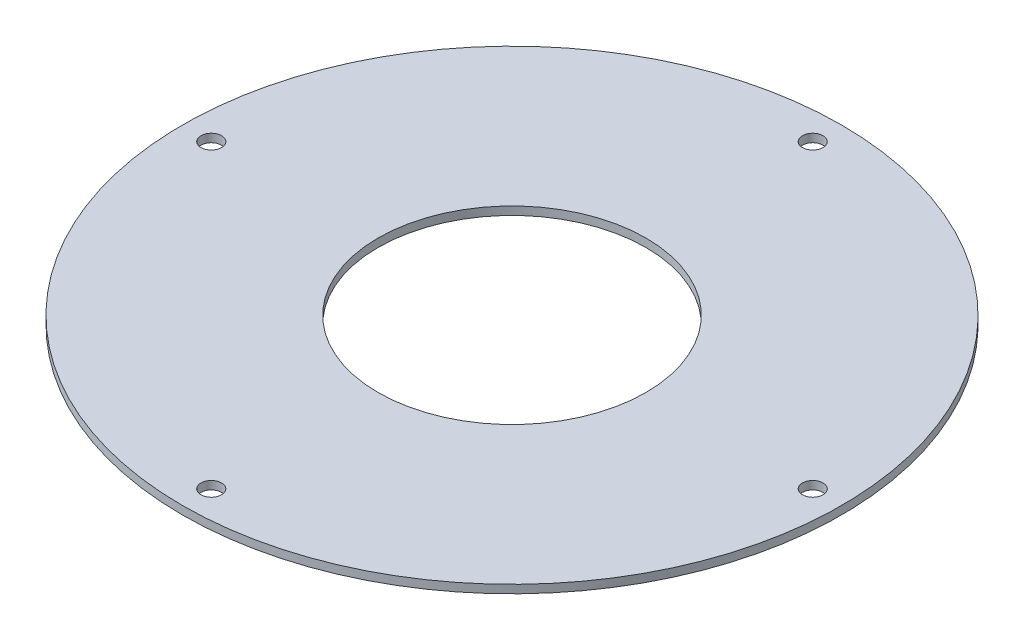
ISO-10303-21;
HEADER;
FILE_DESCRIPTION(('STEP AP214'),'2;1');
FILE_NAME('part.step','',(''),(''),'','','');
FILE_SCHEMA(('AUTOMOTIVE_DESIGN { 1 0 10303 214 1 1 1 1 }'));
ENDSEC;
DATA;
#1=APPLICATION_CONTEXT('core data for automotive mechanical design processes');
#2=APPLICATION_PROTOCOL_DEFINITION('international standard','automotive_design',2000,#1);
#3=PRODUCT_CONTEXT('',#1,'mechanical');
#4=PRODUCT('Part','Part','',(#3));
#5=PRODUCT_RELATED_PRODUCT_CATEGORY('part','',(#4));
#6=PRODUCT_DEFINITION_FORMATION('','',#4);
#7=PRODUCT_DEFINITION_CONTEXT('part definition',#1,'design');
#8=PRODUCT_DEFINITION('design','',#6,#7);
#9=PRODUCT_DEFINITION_SHAPE('','',#8);
#10=(LENGTH_UNIT() NAMED_UNIT(*) SI_UNIT(.MILLI.,.METRE.));
#11=(NAMED_UNIT(*) PLANE_ANGLE_UNIT() SI_UNIT($,.RADIAN.));
#12=(NAMED_UNIT(*) SI_UNIT($,.STERADIAN.) SOLID_ANGLE_UNIT());
#13=UNCERTAINTY_MEASURE_WITH_UNIT(LENGTH_MEASURE(1.E-05),#10,'distance_accuracy_value','');
#14=(GEOMETRIC_REPRESENTATION_CONTEXT(3) GLOBAL_UNCERTAINTY_ASSIGNED_CONTEXT((#13)) GLOBAL_UNIT_ASSIGNED_CONTEXT((#10,
#11,#12)) REPRESENTATION_CONTEXT('',''));
#15=CARTESIAN_POINT('',(0.,0.,0.));
#16=DIRECTION('',(0.,0.,1.));
#17=DIRECTION('',(1.,0.,0.));
#18=AXIS2_PLACEMENT_3D('',#15,#16,#17);
#19=CARTESIAN_POINT('',(0.,2.,0.));
#20=DIRECTION('',(0.,1.,0.));
#21=DIRECTION('',(0.,0.,1.));
#22=AXIS2_PLACEMENT_3D('',#19,#20,#21);
#23=PLANE('',#22);
#24=CARTESIAN_POINT('',(0.,2.,-73.));
#25=DIRECTION('',(0.,1.,0.));
#26=DIRECTION('',(0.,0.,1.));
#27=AXIS2_PLACEMENT_3D('',#24,#25,#26);
#28=CIRCLE('',#27,2.5);
#29=CARTESIAN_POINT('',(0.,2.,-70.5));
#30=VERTEX_POINT('',#29);
#31=EDGE_CURVE('E88',#30,#30,#28,.T.);
#32=ORIENTED_EDGE('',*,*,#31,.F.);
#33=EDGE_LOOP('',(#32));
#34=FACE_BOUND('',#33,.T.);
#35=CARTESIAN_POINT('',(73.,2.,0.));
#36=DIRECTION('',(0.,1.,0.));
#37=DIRECTION('',(0.,0.,1.));
#38=AXIS2_PLACEMENT_3D('',#35,#36,#37);
#39=CIRCLE('',#38,2.50000000000001);
#40=CARTESIAN_POINT('',(73.,2.,2.5));
#41=VERTEX_POINT('',#40);
#42=EDGE_CURVE('E84',#41,#41,#39,.T.);
#43=ORIENTED_EDGE('',*,*,#42,.F.);
#44=EDGE_LOOP('',(#43));
#45=FACE_BOUND('',#44,.T.);
#46=CARTESIAN_POINT('',(0.,2.,73.));
#47=DIRECTION('',(0.,1.,0.));
#48=DIRECTION('',(0.,0.,1.));
#49=AXIS2_PLACEMENT_3D('',#46,#47,#48);
#50=CIRCLE('',#49,2.5);
#51=CARTESIAN_POINT('',(0.,2.,75.5));
#52=VERTEX_POINT('',#51);
#53=EDGE_CURVE('E76',#52,#52,#50,.T.);
#54=ORIENTED_EDGE('',*,*,#53,.F.);
#55=EDGE_LOOP('',(#54));
#56=FACE_BOUND('',#55,.T.);
#57=CARTESIAN_POINT('',(-73.,2.,0.));
#58=DIRECTION('',(0.,1.,0.));
#59=DIRECTION('',(0.,0.,1.));
#60=AXIS2_PLACEMENT_3D('',#57,#58,#59);
#61=CIRCLE('',#60,2.50000000000001);
#62=CARTESIAN_POINT('',(-73.,2.,2.50000000000002));
#63=VERTEX_POINT('',#62);
#64=EDGE_CURVE('E68',#63,#63,#61,.T.);
#65=ORIENTED_EDGE('',*,*,#64,.F.);
#66=EDGE_LOOP('',(#65));
#67=FACE_BOUND('',#66,.T.);
#68=CARTESIAN_POINT('',(0.,2.,0.));
#69=DIRECTION('',(0.,1.,0.));
#70=DIRECTION('',(0.,0.,1.));
#71=AXIS2_PLACEMENT_3D('',#68,#69,#70);
#72=CIRCLE('',#71,80.);
#73=CARTESIAN_POINT('',(0.,2.,80.));
#74=VERTEX_POINT('',#73);
#75=EDGE_CURVE('E10',#74,#74,#72,.T.);
#76=ORIENTED_EDGE('',*,*,#75,.T.);
#77=EDGE_LOOP('',(#76));
#78=FACE_BOUND('',#77,.T.);
#79=CARTESIAN_POINT('',(0.,2.,0.));
#80=DIRECTION('',(0.,1.,0.));
#81=DIRECTION('',(0.,0.,1.));
#82=AXIS2_PLACEMENT_3D('',#79,#80,#81);
#83=CIRCLE('',#82,32.5);
#84=CARTESIAN_POINT('',(0.,2.,32.5));
#85=VERTEX_POINT('',#84);
#86=EDGE_CURVE('E54',#85,#85,#83,.T.);
#87=ORIENTED_EDGE('',*,*,#86,.F.);
#88=EDGE_LOOP('',(#87));
#89=FACE_BOUND('',#88,.T.);
#90=ADVANCED_FACE('F41',(#34,#45,#56,#67,#78,#89),#23,.T.);
#91=CARTESIAN_POINT('',(0.,0.,0.));
#92=DIRECTION('',(0.,1.,0.));
#93=DIRECTION('',(0.,0.,1.));
#94=AXIS2_PLACEMENT_3D('',#91,#92,#93);
#95=PLANE('',#94);
#96=CARTESIAN_POINT('',(0.,0.,-73.));
#97=DIRECTION('',(0.,1.,0.));
#98=DIRECTION('',(0.,0.,1.));
#99=AXIS2_PLACEMENT_3D('',#96,#97,#98);
#100=CIRCLE('',#99,2.5);
#101=CARTESIAN_POINT('',(0.,0.,-70.5));
#102=VERTEX_POINT('',#101);
#103=EDGE_CURVE('E60',#102,#102,#100,.T.);
#104=ORIENTED_EDGE('',*,*,#103,.T.);
#105=EDGE_LOOP('',(#104));
#106=FACE_BOUND('',#105,.T.);
#107=CARTESIAN_POINT('',(73.,0.,0.));
#108=DIRECTION('',(0.,1.,0.));
#109=DIRECTION('',(0.,0.,1.));
#110=AXIS2_PLACEMENT_3D('',#107,#108,#109);
#111=CIRCLE('',#110,2.50000000000001);
#112=CARTESIAN_POINT('',(73.,0.,2.5));
#113=VERTEX_POINT('',#112);
#114=EDGE_CURVE('E80',#113,#113,#111,.T.);
#115=ORIENTED_EDGE('',*,*,#114,.T.);
#116=EDGE_LOOP('',(#115));
#117=FACE_BOUND('',#116,.T.);
#118=CARTESIAN_POINT('',(0.,0.,73.));
#119=DIRECTION('',(0.,1.,0.));
#120=DIRECTION('',(0.,0.,1.));
#121=AXIS2_PLACEMENT_3D('',#118,#119,#120);
#122=CIRCLE('',#121,2.5);
#123=CARTESIAN_POINT('',(0.,0.,75.5));
#124=VERTEX_POINT('',#123);
#125=EDGE_CURVE('E72',#124,#124,#122,.T.);
#126=ORIENTED_EDGE('',*,*,#125,.T.);
#127=EDGE_LOOP('',(#126));
#128=FACE_BOUND('',#127,.T.);
#129=CARTESIAN_POINT('',(-73.,0.,0.));
#130=DIRECTION('',(0.,1.,0.));
#131=DIRECTION('',(0.,0.,1.));
#132=AXIS2_PLACEMENT_3D('',#129,#130,#131);
#133=CIRCLE('',#132,2.50000000000001);
#134=CARTESIAN_POINT('',(-73.,0.,2.50000000000002));
#135=VERTEX_POINT('',#134);
#136=EDGE_CURVE('E64',#135,#135,#133,.T.);
#137=ORIENTED_EDGE('',*,*,#136,.T.);
#138=EDGE_LOOP('',(#137));
#139=FACE_BOUND('',#138,.T.);
#140=CARTESIAN_POINT('',(0.,0.,0.));
#141=DIRECTION('',(0.,1.,0.));
#142=DIRECTION('',(0.,0.,1.));
#143=AXIS2_PLACEMENT_3D('',#140,#141,#142);
#144=CIRCLE('',#143,80.);
#145=CARTESIAN_POINT('',(0.,0.,80.));
#146=VERTEX_POINT('',#145);
#147=EDGE_CURVE('E45',#146,#146,#144,.T.);
#148=ORIENTED_EDGE('',*,*,#147,.F.);
#149=EDGE_LOOP('',(#148));
#150=FACE_BOUND('',#149,.T.);
#151=CARTESIAN_POINT('',(0.,0.,0.));
#152=DIRECTION('',(0.,1.,0.));
#153=DIRECTION('',(0.,0.,1.));
#154=AXIS2_PLACEMENT_3D('',#151,#152,#153);
#155=CIRCLE('',#154,32.5);
#156=CARTESIAN_POINT('',(0.,0.,32.5));
#157=VERTEX_POINT('',#156);
#158=EDGE_CURVE('E56',#157,#157,#155,.T.);
#159=ORIENTED_EDGE('',*,*,#158,.T.);
#160=EDGE_LOOP('',(#159));
#161=FACE_BOUND('',#160,.T.);
#162=ADVANCED_FACE('F96',(#106,#117,#128,#139,#150,#161),#95,.F.);
#163=CARTESIAN_POINT('',(0.,2.,0.));
#164=DIRECTION('',(0.,-1.,0.));
#165=DIRECTION('',(0.,0.,-1.));
#166=AXIS2_PLACEMENT_3D('',#163,#164,#165);
#167=CYLINDRICAL_SURFACE('',#166,80.);
#168=ORIENTED_EDGE('',*,*,#75,.F.);
#169=EDGE_LOOP('',(#168));
#170=FACE_BOUND('',#169,.T.);
#171=ORIENTED_EDGE('',*,*,#147,.T.);
#172=EDGE_LOOP('',(#171));
#173=FACE_BOUND('',#172,.T.);
#174=ADVANCED_FACE('F43',(#170,#173),#167,.T.);
#175=CARTESIAN_POINT('',(0.,2.,0.));
#176=DIRECTION('',(0.,-1.,0.));
#177=DIRECTION('',(0.,0.,-1.));
#178=AXIS2_PLACEMENT_3D('',#175,#176,#177);
#179=CYLINDRICAL_SURFACE('',#178,32.5);
#180=ORIENTED_EDGE('',*,*,#86,.T.);
#181=EDGE_LOOP('',(#180));
#182=FACE_BOUND('',#181,.T.);
#183=ORIENTED_EDGE('',*,*,#158,.F.);
#184=EDGE_LOOP('',(#183));
#185=FACE_BOUND('',#184,.T.);
#186=ADVANCED_FACE('F117',(#182,#185),#179,.F.);
#187=CARTESIAN_POINT('',(-73.,0.,0.));
#188=DIRECTION('',(0.,1.,0.));
#189=DIRECTION('',(0.,0.,1.));
#190=AXIS2_PLACEMENT_3D('',#187,#188,#189);
#191=CYLINDRICAL_SURFACE('',#190,2.50000000000001);
#192=ORIENTED_EDGE('',*,*,#136,.F.);
#193=EDGE_LOOP('',(#192));
#194=FACE_BOUND('',#193,.T.);
#195=ORIENTED_EDGE('',*,*,#64,.T.);
#196=EDGE_LOOP('',(#195));
#197=FACE_BOUND('',#196,.T.);
#198=ADVANCED_FACE('F120',(#194,#197),#191,.F.);
#199=CARTESIAN_POINT('',(0.,0.,73.));
#200=DIRECTION('',(0.,1.,0.));
#201=DIRECTION('',(0.,0.,1.));
#202=AXIS2_PLACEMENT_3D('',#199,#200,#201);
#203=CYLINDRICAL_SURFACE('',#202,2.5);
#204=ORIENTED_EDGE('',*,*,#125,.F.);
#205=EDGE_LOOP('',(#204));
#206=FACE_BOUND('',#205,.T.);
#207=ORIENTED_EDGE('',*,*,#53,.T.);
#208=EDGE_LOOP('',(#207));
#209=FACE_BOUND('',#208,.T.);
#210=ADVANCED_FACE('F132',(#206,#209),#203,.F.);
#211=CARTESIAN_POINT('',(73.,0.,0.));
#212=DIRECTION('',(0.,1.,0.));
#213=DIRECTION('',(0.,0.,1.));
#214=AXIS2_PLACEMENT_3D('',#211,#212,#213);
#215=CYLINDRICAL_SURFACE('',#214,2.50000000000001);
#216=ORIENTED_EDGE('',*,*,#114,.F.);
#217=EDGE_LOOP('',(#216));
#218=FACE_BOUND('',#217,.T.);
#219=ORIENTED_EDGE('',*,*,#42,.T.);
#220=EDGE_LOOP('',(#219));
#221=FACE_BOUND('',#220,.T.);
#222=ADVANCED_FACE('F102',(#218,#221),#215,.F.);
#223=CARTESIAN_POINT('',(0.,0.,-73.));
#224=DIRECTION('',(0.,1.,0.));
#225=DIRECTION('',(0.,0.,1.));
#226=AXIS2_PLACEMENT_3D('',#223,#224,#225);
#227=CYLINDRICAL_SURFACE('',#226,2.5);
#228=ORIENTED_EDGE('',*,*,#103,.F.);
#229=EDGE_LOOP('',(#228));
#230=FACE_BOUND('',#229,.T.);
#231=ORIENTED_EDGE('',*,*,#31,.T.);
#232=EDGE_LOOP('',(#231));
#233=FACE_BOUND('',#232,.T.);
#234=ADVANCED_FACE('F99',(#230,#233),#227,.F.);
#235=CLOSED_SHELL('',(#90,#162,#174,#186,#198,#210,#222,#234));
#236=MANIFOLD_SOLID_BREP('B2',#235);
#237=ADVANCED_BREP_SHAPE_REPRESENTATION('',(#18,#236),#14);
#238=SHAPE_DEFINITION_REPRESENTATION(#9,#237);
ENDSEC;
END-ISO-10303-21;
